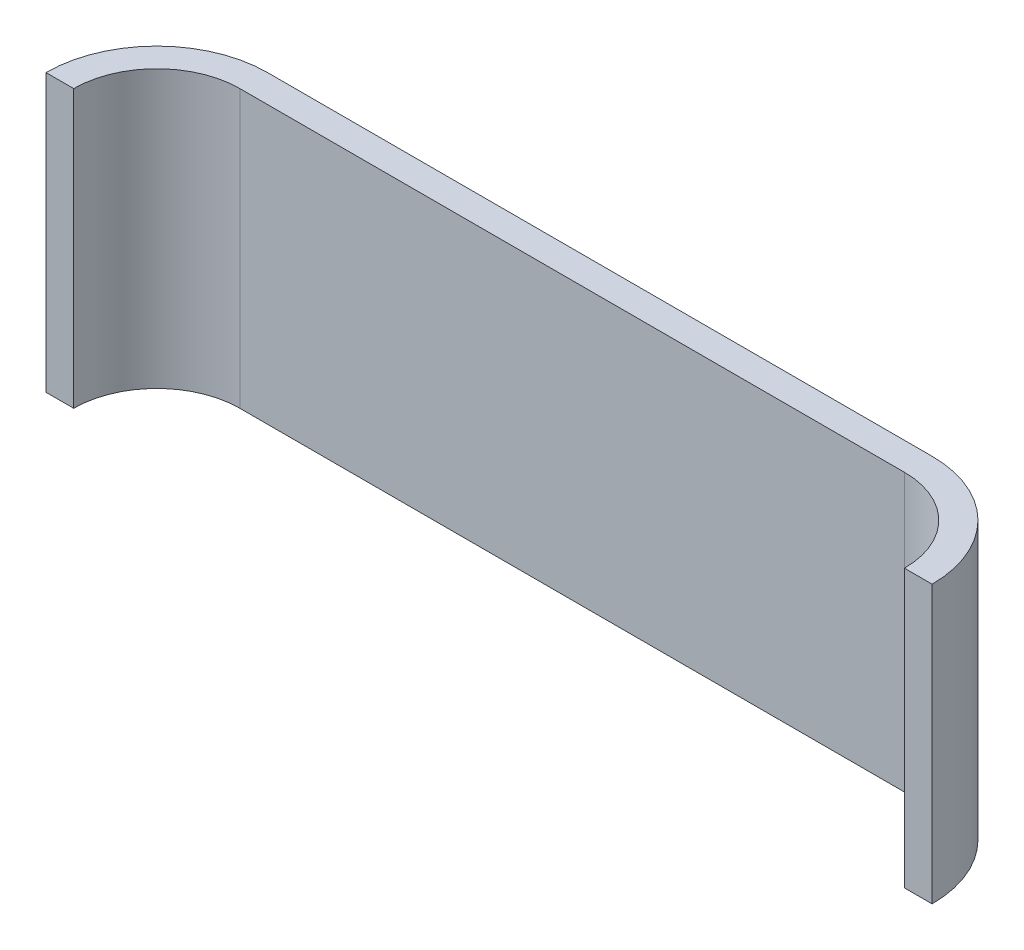
ISO-10303-21;
HEADER;
FILE_DESCRIPTION(('STEP AP214'),'2;1');
FILE_NAME('part.step','',(''),(''),'','','');
FILE_SCHEMA(('AUTOMOTIVE_DESIGN { 1 0 10303 214 1 1 1 1 }'));
ENDSEC;
DATA;
#1=APPLICATION_CONTEXT('core data for automotive mechanical design processes');
#2=APPLICATION_PROTOCOL_DEFINITION('international standard','automotive_design',2000,#1);
#3=PRODUCT_CONTEXT('',#1,'mechanical');
#4=PRODUCT('Part','Part','',(#3));
#5=PRODUCT_RELATED_PRODUCT_CATEGORY('part','',(#4));
#6=PRODUCT_DEFINITION_FORMATION('','',#4);
#7=PRODUCT_DEFINITION_CONTEXT('part definition',#1,'design');
#8=PRODUCT_DEFINITION('design','',#6,#7);
#9=PRODUCT_DEFINITION_SHAPE('','',#8);
#10=(LENGTH_UNIT() NAMED_UNIT(*) SI_UNIT(.MILLI.,.METRE.));
#11=(NAMED_UNIT(*) PLANE_ANGLE_UNIT() SI_UNIT($,.RADIAN.));
#12=(NAMED_UNIT(*) SI_UNIT($,.STERADIAN.) SOLID_ANGLE_UNIT());
#13=UNCERTAINTY_MEASURE_WITH_UNIT(LENGTH_MEASURE(1.E-05),#10,'distance_accuracy_value','');
#14=(GEOMETRIC_REPRESENTATION_CONTEXT(3) GLOBAL_UNCERTAINTY_ASSIGNED_CONTEXT((#13)) GLOBAL_UNIT_ASSIGNED_CONTEXT((#10,
#11,#12)) REPRESENTATION_CONTEXT('',''));
#15=CARTESIAN_POINT('',(0.,0.,0.));
#16=DIRECTION('',(0.,0.,1.));
#17=DIRECTION('',(1.,0.,0.));
#18=AXIS2_PLACEMENT_3D('',#15,#16,#17);
#19=CARTESIAN_POINT('',(1500.,5000.,1500.));
#20=DIRECTION('',(0.,-1.,0.));
#21=DIRECTION('',(0.,0.,-1.));
#22=AXIS2_PLACEMENT_3D('',#19,#20,#21);
#23=CYLINDRICAL_SURFACE('',#22,2000.);
#24=CARTESIAN_POINT('',(1500.,0.,1500.));
#25=DIRECTION('',(0.,1.,0.));
#26=DIRECTION('',(0.,0.,1.));
#27=AXIS2_PLACEMENT_3D('',#24,#25,#26);
#28=CIRCLE('',#27,2000.);
#29=CARTESIAN_POINT('',(1500.00000000001,0.,-500.));
#30=VERTEX_POINT('',#29);
#31=CARTESIAN_POINT('',(-500.,0.,1500.00000000001));
#32=VERTEX_POINT('',#31);
#33=EDGE_CURVE('E142',#30,#32,#28,.T.);
#34=ORIENTED_EDGE('',*,*,#33,.T.);
#35=DIRECTION('',(0.,-1.,0.));
#36=VECTOR('',#35,1.);
#37=CARTESIAN_POINT('',(-500.,5000.,1500.00000000001));
#38=LINE('',#37,#36);
#39=CARTESIAN_POINT('',(-500.,5000.,1500.00000000001));
#40=VERTEX_POINT('',#39);
#41=EDGE_CURVE('E11',#40,#32,#38,.T.);
#42=ORIENTED_EDGE('',*,*,#41,.F.);
#43=CARTESIAN_POINT('',(1500.,5000.,1500.));
#44=DIRECTION('',(0.,1.,0.));
#45=DIRECTION('',(0.,0.,1.));
#46=AXIS2_PLACEMENT_3D('',#43,#44,#45);
#47=CIRCLE('',#46,2000.);
#48=CARTESIAN_POINT('',(1500.00000000001,5000.,-500.));
#49=VERTEX_POINT('',#48);
#50=EDGE_CURVE('E164',#49,#40,#47,.T.);
#51=ORIENTED_EDGE('',*,*,#50,.F.);
#52=DIRECTION('',(0.,-1.,0.));
#53=VECTOR('',#52,1.);
#54=CARTESIAN_POINT('',(1500.00000000001,5000.,-500.));
#55=LINE('',#54,#53);
#56=EDGE_CURVE('E138',#49,#30,#55,.T.);
#57=ORIENTED_EDGE('',*,*,#56,.T.);
#58=EDGE_LOOP('',(#34,#42,#51,#57));
#59=FACE_BOUND('',#58,.T.);
#60=ADVANCED_FACE('F41',(#59),#23,.T.);
#61=CARTESIAN_POINT('',(-500.,5000.,1500.00000000001));
#62=DIRECTION('',(0.,0.,-1.));
#63=DIRECTION('',(-1.,0.,0.));
#64=AXIS2_PLACEMENT_3D('',#61,#62,#63);
#65=PLANE('',#64);
#66=DIRECTION('',(1.,0.,0.));
#67=VECTOR('',#66,1.);
#68=CARTESIAN_POINT('',(-500.,0.,1500.00000000001));
#69=LINE('',#68,#67);
#70=CARTESIAN_POINT('',(0.,0.,1500.00000000001));
#71=VERTEX_POINT('',#70);
#72=EDGE_CURVE('E146',#32,#71,#69,.T.);
#73=ORIENTED_EDGE('',*,*,#72,.T.);
#74=DIRECTION('',(0.,-1.,0.));
#75=VECTOR('',#74,1.);
#76=CARTESIAN_POINT('',(0.,5000.,1500.00000000001));
#77=LINE('',#76,#75);
#78=CARTESIAN_POINT('',(0.,5000.,1500.00000000001));
#79=VERTEX_POINT('',#78);
#80=EDGE_CURVE('E50',#79,#71,#77,.T.);
#81=ORIENTED_EDGE('',*,*,#80,.F.);
#82=DIRECTION('',(1.,0.,0.));
#83=VECTOR('',#82,1.);
#84=CARTESIAN_POINT('',(-500.,5000.,1500.00000000001));
#85=LINE('',#84,#83);
#86=EDGE_CURVE('E101',#40,#79,#85,.T.);
#87=ORIENTED_EDGE('',*,*,#86,.F.);
#88=ORIENTED_EDGE('',*,*,#41,.T.);
#89=EDGE_LOOP('',(#73,#81,#87,#88));
#90=FACE_BOUND('',#89,.T.);
#91=ADVANCED_FACE('F210',(#90),#65,.F.);
#92=CARTESIAN_POINT('',(1500.,5000.,1500.));
#93=DIRECTION('',(0.,-1.,0.));
#94=DIRECTION('',(0.,0.,-1.));
#95=AXIS2_PLACEMENT_3D('',#92,#93,#94);
#96=CYLINDRICAL_SURFACE('',#95,1500.);
#97=CARTESIAN_POINT('',(1500.,0.,1500.));
#98=DIRECTION('',(0.,-1.,0.));
#99=DIRECTION('',(0.,0.,1.));
#100=AXIS2_PLACEMENT_3D('',#97,#98,#99);
#101=CIRCLE('',#100,1500.);
#102=CARTESIAN_POINT('',(1500.00000000001,0.,0.));
#103=VERTEX_POINT('',#102);
#104=EDGE_CURVE('E149',#71,#103,#101,.T.);
#105=ORIENTED_EDGE('',*,*,#104,.T.);
#106=DIRECTION('',(0.,-1.,0.));
#107=VECTOR('',#106,1.);
#108=CARTESIAN_POINT('',(1500.00000000001,5000.,0.));
#109=LINE('',#108,#107);
#110=CARTESIAN_POINT('',(1500.00000000001,5000.,0.));
#111=VERTEX_POINT('',#110);
#112=EDGE_CURVE('E175',#111,#103,#109,.T.);
#113=ORIENTED_EDGE('',*,*,#112,.F.);
#114=CARTESIAN_POINT('',(1500.,5000.,1500.));
#115=DIRECTION('',(0.,-1.,0.));
#116=DIRECTION('',(0.,0.,1.));
#117=AXIS2_PLACEMENT_3D('',#114,#115,#116);
#118=CIRCLE('',#117,1500.);
#119=EDGE_CURVE('E185',#79,#111,#118,.T.);
#120=ORIENTED_EDGE('',*,*,#119,.F.);
#121=ORIENTED_EDGE('',*,*,#80,.T.);
#122=EDGE_LOOP('',(#105,#113,#120,#121));
#123=FACE_BOUND('',#122,.T.);
#124=ADVANCED_FACE('F183',(#123),#96,.F.);
#125=CARTESIAN_POINT('',(1500.00000000001,5000.,0.));
#126=DIRECTION('',(0.,0.,-1.));
#127=DIRECTION('',(-1.,0.,0.));
#128=AXIS2_PLACEMENT_3D('',#125,#126,#127);
#129=PLANE('',#128);
#130=DIRECTION('',(1.,0.,0.));
#131=VECTOR('',#130,1.);
#132=CARTESIAN_POINT('',(1500.00000000001,0.,0.));
#133=LINE('',#132,#131);
#134=CARTESIAN_POINT('',(13500.,0.,-2.22044604925031E-13));
#135=VERTEX_POINT('',#134);
#136=EDGE_CURVE('E152',#103,#135,#133,.T.);
#137=ORIENTED_EDGE('',*,*,#136,.T.);
#138=DIRECTION('',(0.,-1.,0.));
#139=VECTOR('',#138,1.);
#140=CARTESIAN_POINT('',(13500.,5000.,-2.22044604925031E-13));
#141=LINE('',#140,#139);
#142=CARTESIAN_POINT('',(13500.,5000.,-2.22044604925031E-13));
#143=VERTEX_POINT('',#142);
#144=EDGE_CURVE('E171',#143,#135,#141,.T.);
#145=ORIENTED_EDGE('',*,*,#144,.F.);
#146=DIRECTION('',(1.,0.,0.));
#147=VECTOR('',#146,1.);
#148=CARTESIAN_POINT('',(1500.00000000001,5000.,0.));
#149=LINE('',#148,#147);
#150=EDGE_CURVE('E198',#111,#143,#149,.T.);
#151=ORIENTED_EDGE('',*,*,#150,.F.);
#152=ORIENTED_EDGE('',*,*,#112,.T.);
#153=EDGE_LOOP('',(#137,#145,#151,#152));
#154=FACE_BOUND('',#153,.T.);
#155=ADVANCED_FACE('F193',(#154),#129,.F.);
#156=CARTESIAN_POINT('',(13500.,5000.,1500.));
#157=DIRECTION('',(0.,-1.,0.));
#158=DIRECTION('',(0.,0.,-1.));
#159=AXIS2_PLACEMENT_3D('',#156,#157,#158);
#160=CYLINDRICAL_SURFACE('',#159,1500.);
#161=CARTESIAN_POINT('',(13500.,0.,1500.));
#162=DIRECTION('',(0.,-1.,0.));
#163=DIRECTION('',(0.,0.,1.));
#164=AXIS2_PLACEMENT_3D('',#161,#162,#163);
#165=CIRCLE('',#164,1500.);
#166=CARTESIAN_POINT('',(15000.,0.,1500.00000000001));
#167=VERTEX_POINT('',#166);
#168=EDGE_CURVE('E155',#135,#167,#165,.T.);
#169=ORIENTED_EDGE('',*,*,#168,.T.);
#170=DIRECTION('',(0.,-1.,0.));
#171=VECTOR('',#170,1.);
#172=CARTESIAN_POINT('',(15000.,5000.,1500.00000000001));
#173=LINE('',#172,#171);
#174=CARTESIAN_POINT('',(15000.,5000.,1500.00000000001));
#175=VERTEX_POINT('',#174);
#176=EDGE_CURVE('E131',#175,#167,#173,.T.);
#177=ORIENTED_EDGE('',*,*,#176,.F.);
#178=CARTESIAN_POINT('',(13500.,5000.,1500.));
#179=DIRECTION('',(0.,-1.,0.));
#180=DIRECTION('',(0.,0.,1.));
#181=AXIS2_PLACEMENT_3D('',#178,#179,#180);
#182=CIRCLE('',#181,1500.);
#183=EDGE_CURVE('E120',#143,#175,#182,.T.);
#184=ORIENTED_EDGE('',*,*,#183,.F.);
#185=ORIENTED_EDGE('',*,*,#144,.T.);
#186=EDGE_LOOP('',(#169,#177,#184,#185));
#187=FACE_BOUND('',#186,.T.);
#188=ADVANCED_FACE('F196',(#187),#160,.F.);
#189=CARTESIAN_POINT('',(15500.,5000.,1500.00000000001));
#190=DIRECTION('',(0.,0.,-1.));
#191=DIRECTION('',(-1.,0.,0.));
#192=AXIS2_PLACEMENT_3D('',#189,#190,#191);
#193=PLANE('',#192);
#194=DIRECTION('',(1.,0.,0.));
#195=VECTOR('',#194,1.);
#196=CARTESIAN_POINT('',(15500.,0.,1500.00000000001));
#197=LINE('',#196,#195);
#198=CARTESIAN_POINT('',(15500.,0.,1500.00000000001));
#199=VERTEX_POINT('',#198);
#200=EDGE_CURVE('E129',#167,#199,#197,.T.);
#201=ORIENTED_EDGE('',*,*,#200,.T.);
#202=DIRECTION('',(0.,-1.,0.));
#203=VECTOR('',#202,1.);
#204=CARTESIAN_POINT('',(15500.,5000.,1500.00000000001));
#205=LINE('',#204,#203);
#206=CARTESIAN_POINT('',(15500.,5000.,1500.00000000001));
#207=VERTEX_POINT('',#206);
#208=EDGE_CURVE('E126',#207,#199,#205,.T.);
#209=ORIENTED_EDGE('',*,*,#208,.F.);
#210=DIRECTION('',(1.,0.,0.));
#211=VECTOR('',#210,1.);
#212=CARTESIAN_POINT('',(15500.,5000.,1500.00000000001));
#213=LINE('',#212,#211);
#214=EDGE_CURVE('E114',#175,#207,#213,.T.);
#215=ORIENTED_EDGE('',*,*,#214,.F.);
#216=ORIENTED_EDGE('',*,*,#176,.T.);
#217=EDGE_LOOP('',(#201,#209,#215,#216));
#218=FACE_BOUND('',#217,.T.);
#219=ADVANCED_FACE('F127',(#218),#193,.F.);
#220=CARTESIAN_POINT('',(13500.,5000.,1500.));
#221=DIRECTION('',(0.,-1.,0.));
#222=DIRECTION('',(0.,0.,-1.));
#223=AXIS2_PLACEMENT_3D('',#220,#221,#222);
#224=CYLINDRICAL_SURFACE('',#223,2000.);
#225=CARTESIAN_POINT('',(13500.,0.,1500.));
#226=DIRECTION('',(0.,1.,0.));
#227=DIRECTION('',(0.,0.,1.));
#228=AXIS2_PLACEMENT_3D('',#225,#226,#227);
#229=CIRCLE('',#228,2000.);
#230=CARTESIAN_POINT('',(13500.,0.,-500.));
#231=VERTEX_POINT('',#230);
#232=EDGE_CURVE('E87',#199,#231,#229,.T.);
#233=ORIENTED_EDGE('',*,*,#232,.T.);
#234=DIRECTION('',(0.,-1.,0.));
#235=VECTOR('',#234,1.);
#236=CARTESIAN_POINT('',(13500.,5000.,-500.));
#237=LINE('',#236,#235);
#238=CARTESIAN_POINT('',(13500.,5000.,-500.));
#239=VERTEX_POINT('',#238);
#240=EDGE_CURVE('E132',#239,#231,#237,.T.);
#241=ORIENTED_EDGE('',*,*,#240,.F.);
#242=CARTESIAN_POINT('',(13500.,5000.,1500.));
#243=DIRECTION('',(0.,1.,0.));
#244=DIRECTION('',(0.,0.,1.));
#245=AXIS2_PLACEMENT_3D('',#242,#243,#244);
#246=CIRCLE('',#245,2000.);
#247=EDGE_CURVE('E118',#207,#239,#246,.T.);
#248=ORIENTED_EDGE('',*,*,#247,.F.);
#249=ORIENTED_EDGE('',*,*,#208,.T.);
#250=EDGE_LOOP('',(#233,#241,#248,#249));
#251=FACE_BOUND('',#250,.T.);
#252=ADVANCED_FACE('F134',(#251),#224,.T.);
#253=CARTESIAN_POINT('',(1500.00000000001,5000.,-500.));
#254=DIRECTION('',(0.,0.,1.));
#255=DIRECTION('',(1.,0.,0.));
#256=AXIS2_PLACEMENT_3D('',#253,#254,#255);
#257=PLANE('',#256);
#258=DIRECTION('',(-1.,0.,0.));
#259=VECTOR('',#258,1.);
#260=CARTESIAN_POINT('',(1500.00000000001,0.,-500.));
#261=LINE('',#260,#259);
#262=EDGE_CURVE('E93',#231,#30,#261,.T.);
#263=ORIENTED_EDGE('',*,*,#262,.T.);
#264=ORIENTED_EDGE('',*,*,#56,.F.);
#265=DIRECTION('',(-1.,0.,0.));
#266=VECTOR('',#265,1.);
#267=CARTESIAN_POINT('',(1500.00000000001,5000.,-500.));
#268=LINE('',#267,#266);
#269=EDGE_CURVE('E58',#239,#49,#268,.T.);
#270=ORIENTED_EDGE('',*,*,#269,.F.);
#271=ORIENTED_EDGE('',*,*,#240,.T.);
#272=EDGE_LOOP('',(#263,#264,#270,#271));
#273=FACE_BOUND('',#272,.T.);
#274=ADVANCED_FACE('F226',(#273),#257,.F.);
#275=CARTESIAN_POINT('',(1500.,5000.,1500.));
#276=DIRECTION('',(0.,1.,0.));
#277=DIRECTION('',(0.,0.,1.));
#278=AXIS2_PLACEMENT_3D('',#275,#276,#277);
#279=PLANE('',#278);
#280=ORIENTED_EDGE('',*,*,#50,.T.);
#281=ORIENTED_EDGE('',*,*,#86,.T.);
#282=ORIENTED_EDGE('',*,*,#119,.T.);
#283=ORIENTED_EDGE('',*,*,#150,.T.);
#284=ORIENTED_EDGE('',*,*,#183,.T.);
#285=ORIENTED_EDGE('',*,*,#214,.T.);
#286=ORIENTED_EDGE('',*,*,#247,.T.);
#287=ORIENTED_EDGE('',*,*,#269,.T.);
#288=EDGE_LOOP('',(#280,#281,#282,#283,#284,#285,#286,#287));
#289=FACE_BOUND('',#288,.T.);
#290=ADVANCED_FACE('F116',(#289),#279,.T.);
#291=CARTESIAN_POINT('',(1500.,0.,1500.));
#292=DIRECTION('',(0.,1.,0.));
#293=DIRECTION('',(0.,0.,1.));
#294=AXIS2_PLACEMENT_3D('',#291,#292,#293);
#295=PLANE('',#294);
#296=ORIENTED_EDGE('',*,*,#33,.F.);
#297=ORIENTED_EDGE('',*,*,#262,.F.);
#298=ORIENTED_EDGE('',*,*,#232,.F.);
#299=ORIENTED_EDGE('',*,*,#200,.F.);
#300=ORIENTED_EDGE('',*,*,#168,.F.);
#301=ORIENTED_EDGE('',*,*,#136,.F.);
#302=ORIENTED_EDGE('',*,*,#104,.F.);
#303=ORIENTED_EDGE('',*,*,#72,.F.);
#304=EDGE_LOOP('',(#296,#297,#298,#299,#300,#301,#302,#303));
#305=FACE_BOUND('',#304,.T.);
#306=ADVANCED_FACE('F189',(#305),#295,.F.);
#307=CLOSED_SHELL('',(#60,#91,#124,#155,#188,#219,#252,#274,#290,#306));
#308=MANIFOLD_SOLID_BREP('B2',#307);
#309=ADVANCED_BREP_SHAPE_REPRESENTATION('',(#18,#308),#14);
#310=SHAPE_DEFINITION_REPRESENTATION(#9,#309);
ENDSEC;
END-ISO-10303-21;
